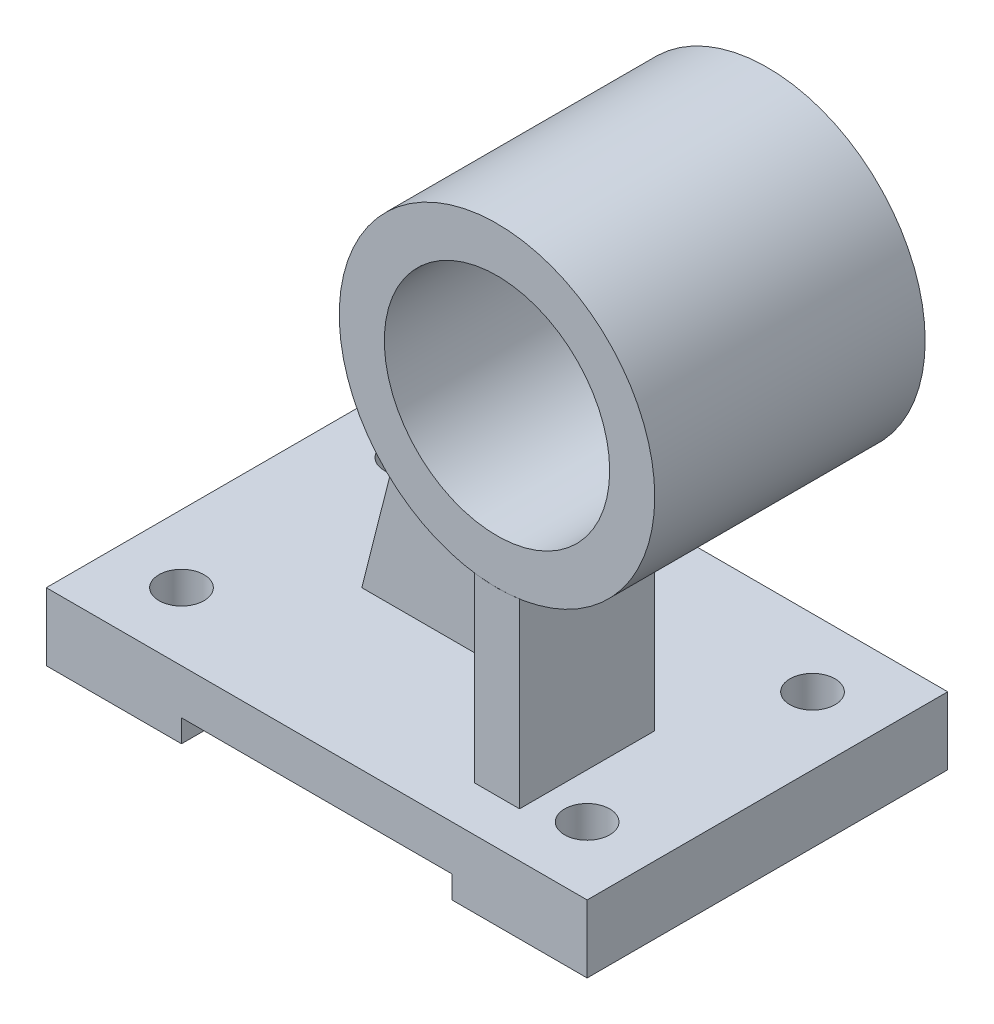
ISO-10303-21;
HEADER;
FILE_DESCRIPTION(('STEP AP214'),'2;1');
FILE_NAME('part.step','',(''),(''),'','','');
FILE_SCHEMA(('AUTOMOTIVE_DESIGN { 1 0 10303 214 1 1 1 1 }'));
ENDSEC;
DATA;
#1=APPLICATION_CONTEXT('core data for automotive mechanical design processes');
#2=APPLICATION_PROTOCOL_DEFINITION('international standard','automotive_design',2000,#1);
#3=PRODUCT_CONTEXT('',#1,'mechanical');
#4=PRODUCT('Part','Part','',(#3));
#5=PRODUCT_RELATED_PRODUCT_CATEGORY('part','',(#4));
#6=PRODUCT_DEFINITION_FORMATION('','',#4);
#7=PRODUCT_DEFINITION_CONTEXT('part definition',#1,'design');
#8=PRODUCT_DEFINITION('design','',#6,#7);
#9=PRODUCT_DEFINITION_SHAPE('','',#8);
#10=(LENGTH_UNIT() NAMED_UNIT(*) SI_UNIT(.MILLI.,.METRE.));
#11=(NAMED_UNIT(*) PLANE_ANGLE_UNIT() SI_UNIT($,.RADIAN.));
#12=(NAMED_UNIT(*) SI_UNIT($,.STERADIAN.) SOLID_ANGLE_UNIT());
#13=UNCERTAINTY_MEASURE_WITH_UNIT(LENGTH_MEASURE(1.E-05),#10,'distance_accuracy_value','');
#14=(GEOMETRIC_REPRESENTATION_CONTEXT(3) GLOBAL_UNCERTAINTY_ASSIGNED_CONTEXT((#13)) GLOBAL_UNIT_ASSIGNED_CONTEXT((#10,
#11,#12)) REPRESENTATION_CONTEXT('',''));
#15=CARTESIAN_POINT('',(0.,0.,0.));
#16=DIRECTION('',(0.,0.,1.));
#17=DIRECTION('',(1.,0.,0.));
#18=AXIS2_PLACEMENT_3D('',#15,#16,#17);
#19=CARTESIAN_POINT('',(-4.99999999999999,0.,5.));
#20=DIRECTION('',(1.,0.,0.));
#21=DIRECTION('',(0.,0.,-1.));
#22=AXIS2_PLACEMENT_3D('',#19,#20,#21);
#23=PLANE('',#22);
#24=DIRECTION('',(0.,-1.,0.));
#25=VECTOR('',#24,1.);
#26=CARTESIAN_POINT('',(-4.99999999999999,0.,-5.));
#27=LINE('',#26,#25);
#28=CARTESIAN_POINT('',(-4.99999999999999,-34.6410161513776,-5.));
#29=VERTEX_POINT('',#28);
#30=CARTESIAN_POINT('',(-4.99999999999999,-74.9643222802541,-5.));
#31=VERTEX_POINT('',#30);
#32=EDGE_CURVE('E118',#29,#31,#27,.T.);
#33=ORIENTED_EDGE('',*,*,#32,.F.);
#34=DIRECTION('',(0.,0.,-1.));
#35=VECTOR('',#34,1.);
#36=CARTESIAN_POINT('',(-4.99999999999999,-34.6410161513776,5.));
#37=LINE('',#36,#35);
#38=CARTESIAN_POINT('',(-4.99999999999999,-34.6410161513776,5.));
#39=VERTEX_POINT('',#38);
#40=EDGE_CURVE('E12',#39,#29,#37,.T.);
#41=ORIENTED_EDGE('',*,*,#40,.F.);
#42=DIRECTION('',(0.,-1.,0.));
#43=VECTOR('',#42,1.);
#44=CARTESIAN_POINT('',(-4.99999999999999,0.,5.));
#45=LINE('',#44,#43);
#46=CARTESIAN_POINT('',(-4.99999999999999,-74.9643222802541,5.));
#47=VERTEX_POINT('',#46);
#48=EDGE_CURVE('E103',#39,#47,#45,.T.);
#49=ORIENTED_EDGE('',*,*,#48,.T.);
#50=DIRECTION('',(0.,0.,-1.));
#51=VECTOR('',#50,1.);
#52=CARTESIAN_POINT('',(-4.99999999999999,-74.9643222802541,5.));
#53=LINE('',#52,#51);
#54=EDGE_CURVE('E71',#47,#31,#53,.T.);
#55=ORIENTED_EDGE('',*,*,#54,.T.);
#56=EDGE_LOOP('',(#33,#41,#49,#55));
#57=FACE_BOUND('',#56,.T.);
#58=ADVANCED_FACE('F55',(#57),#23,.T.);
#59=CARTESIAN_POINT('',(0.,0.,5.));
#60=DIRECTION('',(0.,0.,-1.));
#61=DIRECTION('',(-1.,0.,0.));
#62=AXIS2_PLACEMENT_3D('',#59,#60,#61);
#63=CYLINDRICAL_SURFACE('',#62,35.);
#64=CARTESIAN_POINT('',(0.,0.,-5.));
#65=DIRECTION('',(0.,0.,1.));
#66=DIRECTION('',(1.,0.,0.));
#67=AXIS2_PLACEMENT_3D('',#64,#65,#66);
#68=CIRCLE('',#67,35.);
#69=CARTESIAN_POINT('',(-34.4885704092509,5.96141854982036,-5.));
#70=VERTEX_POINT('',#69);
#71=EDGE_CURVE('E109',#29,#70,#68,.F.);
#72=ORIENTED_EDGE('',*,*,#71,.T.);
#73=DIRECTION('',(0.,0.,-1.));
#74=VECTOR('',#73,1.);
#75=CARTESIAN_POINT('',(-34.4885704092509,5.96141854982036,5.));
#76=LINE('',#75,#74);
#77=CARTESIAN_POINT('',(-34.4885704092509,5.96141854982036,5.));
#78=VERTEX_POINT('',#77);
#79=EDGE_CURVE('E63',#78,#70,#76,.T.);
#80=ORIENTED_EDGE('',*,*,#79,.F.);
#81=CARTESIAN_POINT('',(0.,0.,5.));
#82=DIRECTION('',(0.,0.,1.));
#83=DIRECTION('',(1.,0.,0.));
#84=AXIS2_PLACEMENT_3D('',#81,#82,#83);
#85=CIRCLE('',#84,35.);
#86=EDGE_CURVE('E97',#39,#78,#85,.F.);
#87=ORIENTED_EDGE('',*,*,#86,.F.);
#88=ORIENTED_EDGE('',*,*,#40,.T.);
#89=EDGE_LOOP('',(#72,#80,#87,#88));
#90=FACE_BOUND('',#89,.T.);
#91=ADVANCED_FACE('F107',(#90),#63,.F.);
#92=CARTESIAN_POINT('',(-33.8264734105136,8.57365432242354,5.));
#93=DIRECTION('',(-0.969348225849847,0.24569089735225,0.));
#94=DIRECTION('',(-0.24569089735225,-0.969348225849847,0.));
#95=AXIS2_PLACEMENT_3D('',#92,#93,#94);
#96=PLANE('',#95);
#97=DIRECTION('',(0.245690897352251,0.969348225849847,0.));
#98=VECTOR('',#97,1.);
#99=CARTESIAN_POINT('',(-33.8264734105136,8.57365432242354,-5.));
#100=LINE('',#99,#98);
#101=CARTESIAN_POINT('',(-55.,-74.9643222802542,-5.));
#102=VERTEX_POINT('',#101);
#103=EDGE_CURVE('E121',#102,#70,#100,.T.);
#104=ORIENTED_EDGE('',*,*,#103,.F.);
#105=DIRECTION('',(0.,0.,-1.));
#106=VECTOR('',#105,1.);
#107=CARTESIAN_POINT('',(-55.,-74.9643222802542,5.));
#108=LINE('',#107,#106);
#109=CARTESIAN_POINT('',(-55.,-74.9643222802542,5.));
#110=VERTEX_POINT('',#109);
#111=EDGE_CURVE('E84',#110,#102,#108,.T.);
#112=ORIENTED_EDGE('',*,*,#111,.F.);
#113=DIRECTION('',(0.245690897352251,0.969348225849847,0.));
#114=VECTOR('',#113,1.);
#115=CARTESIAN_POINT('',(-33.8264734105136,8.57365432242354,5.));
#116=LINE('',#115,#114);
#117=EDGE_CURVE('E102',#110,#78,#116,.T.);
#118=ORIENTED_EDGE('',*,*,#117,.T.);
#119=ORIENTED_EDGE('',*,*,#79,.T.);
#120=EDGE_LOOP('',(#104,#112,#118,#119));
#121=FACE_BOUND('',#120,.T.);
#122=ADVANCED_FACE('F112',(#121),#96,.T.);
#123=CARTESIAN_POINT('',(0.,-74.9643222802541,5.));
#124=DIRECTION('',(0.,-1.,0.));
#125=DIRECTION('',(1.,0.,0.));
#126=AXIS2_PLACEMENT_3D('',#123,#124,#125);
#127=PLANE('',#126);
#128=DIRECTION('',(-1.,0.,0.));
#129=VECTOR('',#128,1.);
#130=CARTESIAN_POINT('',(0.,-74.9643222802541,-5.));
#131=LINE('',#130,#129);
#132=EDGE_CURVE('E123',#31,#102,#131,.T.);
#133=ORIENTED_EDGE('',*,*,#132,.F.);
#134=ORIENTED_EDGE('',*,*,#54,.F.);
#135=DIRECTION('',(-1.,0.,0.));
#136=VECTOR('',#135,1.);
#137=CARTESIAN_POINT('',(0.,-74.9643222802541,5.));
#138=LINE('',#137,#136);
#139=EDGE_CURVE('E113',#47,#110,#138,.T.);
#140=ORIENTED_EDGE('',*,*,#139,.T.);
#141=ORIENTED_EDGE('',*,*,#111,.T.);
#142=EDGE_LOOP('',(#133,#134,#140,#141));
#143=FACE_BOUND('',#142,.T.);
#144=ADVANCED_FACE('F128',(#143),#127,.T.);
#145=CARTESIAN_POINT('',(0.,0.,5.));
#146=DIRECTION('',(0.,0.,1.));
#147=DIRECTION('',(1.,0.,0.));
#148=AXIS2_PLACEMENT_3D('',#145,#146,#147);
#149=PLANE('',#148);
#150=ORIENTED_EDGE('',*,*,#48,.F.);
#151=ORIENTED_EDGE('',*,*,#86,.T.);
#152=ORIENTED_EDGE('',*,*,#117,.F.);
#153=ORIENTED_EDGE('',*,*,#139,.F.);
#154=EDGE_LOOP('',(#150,#151,#152,#153));
#155=FACE_BOUND('',#154,.T.);
#156=ADVANCED_FACE('F99',(#155),#149,.T.);
#157=CARTESIAN_POINT('',(0.,0.,-5.));
#158=DIRECTION('',(0.,0.,1.));
#159=DIRECTION('',(1.,0.,0.));
#160=AXIS2_PLACEMENT_3D('',#157,#158,#159);
#161=PLANE('',#160);
#162=ORIENTED_EDGE('',*,*,#32,.T.);
#163=ORIENTED_EDGE('',*,*,#132,.T.);
#164=ORIENTED_EDGE('',*,*,#103,.T.);
#165=ORIENTED_EDGE('',*,*,#71,.F.);
#166=EDGE_LOOP('',(#162,#163,#164,#165));
#167=FACE_BOUND('',#166,.T.);
#168=ADVANCED_FACE('F135',(#167),#161,.F.);
#169=CLOSED_SHELL('',(#58,#91,#122,#144,#156,#168));
#170=MANIFOLD_SOLID_BREP('B2',#169);
#171=CARTESIAN_POINT('',(-4.99999999999999,0.,0.));
#172=DIRECTION('',(1.,0.,0.));
#173=DIRECTION('',(0.,0.,-1.));
#174=AXIS2_PLACEMENT_3D('',#171,#172,#173);
#175=PLANE('',#174);
#176=DIRECTION('',(0.,1.,0.));
#177=VECTOR('',#176,1.);
#178=CARTESIAN_POINT('',(-4.99999999999999,0.,30.));
#179=LINE('',#178,#177);
#180=CARTESIAN_POINT('',(-4.99999999999999,-74.9643222802541,30.));
#181=VERTEX_POINT('',#180);
#182=CARTESIAN_POINT('',(-4.99999999999999,-34.6410161513776,30.));
#183=VERTEX_POINT('',#182);
#184=EDGE_CURVE('E227',#181,#183,#179,.T.);
#185=ORIENTED_EDGE('',*,*,#184,.T.);
#186=DIRECTION('',(0.,0.,1.));
#187=VECTOR('',#186,1.);
#188=CARTESIAN_POINT('',(-4.99999999999999,-34.6410161513776,0.));
#189=LINE('',#188,#187);
#190=CARTESIAN_POINT('',(-4.99999999999999,-34.6410161513776,0.));
#191=VERTEX_POINT('',#190);
#192=EDGE_CURVE('E207',#191,#183,#189,.T.);
#193=ORIENTED_EDGE('',*,*,#192,.F.);
#194=DIRECTION('',(0.,1.,0.));
#195=VECTOR('',#194,1.);
#196=CARTESIAN_POINT('',(-4.99999999999999,0.,0.));
#197=LINE('',#196,#195);
#198=CARTESIAN_POINT('',(-4.99999999999999,-74.9643222802541,0.));
#199=VERTEX_POINT('',#198);
#200=EDGE_CURVE('E215',#199,#191,#197,.T.);
#201=ORIENTED_EDGE('',*,*,#200,.F.);
#202=DIRECTION('',(0.,0.,1.));
#203=VECTOR('',#202,1.);
#204=CARTESIAN_POINT('',(-4.99999999999999,-74.9643222802541,0.));
#205=LINE('',#204,#203);
#206=EDGE_CURVE('E53',#199,#181,#205,.T.);
#207=ORIENTED_EDGE('',*,*,#206,.T.);
#208=EDGE_LOOP('',(#185,#193,#201,#207));
#209=FACE_BOUND('',#208,.T.);
#210=ADVANCED_FACE('F197',(#209),#175,.F.);
#211=CARTESIAN_POINT('',(0.,0.,0.));
#212=DIRECTION('',(0.,0.,1.));
#213=DIRECTION('',(1.,0.,0.));
#214=AXIS2_PLACEMENT_3D('',#211,#212,#213);
#215=CYLINDRICAL_SURFACE('',#214,35.);
#216=CARTESIAN_POINT('',(0.,0.,30.));
#217=DIRECTION('',(0.,0.,1.));
#218=DIRECTION('',(1.,0.,0.));
#219=AXIS2_PLACEMENT_3D('',#216,#217,#218);
#220=CIRCLE('',#219,35.);
#221=CARTESIAN_POINT('',(5.00000000000001,-34.6410161513776,30.));
#222=VERTEX_POINT('',#221);
#223=EDGE_CURVE('E336',#183,#222,#220,.T.);
#224=ORIENTED_EDGE('',*,*,#223,.T.);
#225=DIRECTION('',(0.,0.,1.));
#226=VECTOR('',#225,1.);
#227=CARTESIAN_POINT('',(5.00000000000001,-34.6410161513776,0.));
#228=LINE('',#227,#226);
#229=CARTESIAN_POINT('',(5.00000000000001,-34.6410161513776,0.));
#230=VERTEX_POINT('',#229);
#231=EDGE_CURVE('E340',#230,#222,#228,.T.);
#232=ORIENTED_EDGE('',*,*,#231,.F.);
#233=CARTESIAN_POINT('',(0.,0.,0.));
#234=DIRECTION('',(0.,0.,1.));
#235=DIRECTION('',(1.,0.,0.));
#236=AXIS2_PLACEMENT_3D('',#233,#234,#235);
#237=CIRCLE('',#236,35.);
#238=EDGE_CURVE('E331',#191,#230,#237,.T.);
#239=ORIENTED_EDGE('',*,*,#238,.F.);
#240=ORIENTED_EDGE('',*,*,#192,.T.);
#241=EDGE_LOOP('',(#224,#232,#239,#240));
#242=FACE_BOUND('',#241,.T.);
#243=ADVANCED_FACE('F348',(#242),#215,.F.);
#244=CARTESIAN_POINT('',(5.00000000000001,0.,0.));
#245=DIRECTION('',(1.,0.,0.));
#246=DIRECTION('',(0.,0.,-1.));
#247=AXIS2_PLACEMENT_3D('',#244,#245,#246);
#248=PLANE('',#247);
#249=DIRECTION('',(0.,1.,0.));
#250=VECTOR('',#249,1.);
#251=CARTESIAN_POINT('',(5.00000000000001,0.,30.));
#252=LINE('',#251,#250);
#253=CARTESIAN_POINT('',(5.00000000000001,-74.9643222802541,30.));
#254=VERTEX_POINT('',#253);
#255=EDGE_CURVE('E321',#254,#222,#252,.T.);
#256=ORIENTED_EDGE('',*,*,#255,.F.);
#257=DIRECTION('',(0.,0.,1.));
#258=VECTOR('',#257,1.);
#259=CARTESIAN_POINT('',(5.00000000000001,-74.9643222802541,0.));
#260=LINE('',#259,#258);
#261=CARTESIAN_POINT('',(5.00000000000001,-74.9643222802541,0.));
#262=VERTEX_POINT('',#261);
#263=EDGE_CURVE('E201',#262,#254,#260,.T.);
#264=ORIENTED_EDGE('',*,*,#263,.F.);
#265=DIRECTION('',(0.,1.,0.));
#266=VECTOR('',#265,1.);
#267=CARTESIAN_POINT('',(5.00000000000001,0.,0.));
#268=LINE('',#267,#266);
#269=EDGE_CURVE('E329',#262,#230,#268,.T.);
#270=ORIENTED_EDGE('',*,*,#269,.T.);
#271=ORIENTED_EDGE('',*,*,#231,.T.);
#272=EDGE_LOOP('',(#256,#264,#270,#271));
#273=FACE_BOUND('',#272,.T.);
#274=ADVANCED_FACE('F199',(#273),#248,.T.);
#275=CARTESIAN_POINT('',(0.,0.,0.));
#276=DIRECTION('',(0.,0.,1.));
#277=DIRECTION('',(1.,0.,0.));
#278=AXIS2_PLACEMENT_3D('',#275,#276,#277);
#279=PLANE('',#278);
#280=DIRECTION('',(-1.,0.,0.));
#281=VECTOR('',#280,1.);
#282=CARTESIAN_POINT('',(0.,-74.9643222802541,0.));
#283=LINE('',#282,#281);
#284=EDGE_CURVE('E327',#262,#199,#283,.T.);
#285=ORIENTED_EDGE('',*,*,#284,.T.);
#286=ORIENTED_EDGE('',*,*,#200,.T.);
#287=ORIENTED_EDGE('',*,*,#238,.T.);
#288=ORIENTED_EDGE('',*,*,#269,.F.);
#289=EDGE_LOOP('',(#285,#286,#287,#288));
#290=FACE_BOUND('',#289,.T.);
#291=ADVANCED_FACE('F345',(#290),#279,.F.);
#292=CARTESIAN_POINT('',(0.,0.,30.));
#293=DIRECTION('',(0.,0.,1.));
#294=DIRECTION('',(1.,0.,0.));
#295=AXIS2_PLACEMENT_3D('',#292,#293,#294);
#296=PLANE('',#295);
#297=DIRECTION('',(-1.,0.,0.));
#298=VECTOR('',#297,1.);
#299=CARTESIAN_POINT('',(0.,-74.9643222802541,30.));
#300=LINE('',#299,#298);
#301=EDGE_CURVE('E318',#254,#181,#300,.T.);
#302=ORIENTED_EDGE('',*,*,#301,.F.);
#303=ORIENTED_EDGE('',*,*,#255,.T.);
#304=ORIENTED_EDGE('',*,*,#223,.F.);
#305=ORIENTED_EDGE('',*,*,#184,.F.);
#306=EDGE_LOOP('',(#302,#303,#304,#305));
#307=FACE_BOUND('',#306,.T.);
#308=ADVANCED_FACE('F353',(#307),#296,.T.);
#309=CARTESIAN_POINT('',(0.,-74.9643222802541,40.));
#310=DIRECTION('',(0.,-1.,0.));
#311=DIRECTION('',(0.,0.,-1.));
#312=AXIS2_PLACEMENT_3D('',#309,#310,#311);
#313=PLANE('',#312);
#314=CARTESIAN_POINT('',(15.,-74.9643222802541,-25.));
#315=DIRECTION('',(0.,1.,0.));
#316=DIRECTION('',(0.,0.,-1.));
#317=AXIS2_PLACEMENT_3D('',#314,#315,#316);
#318=CIRCLE('',#317,5.);
#319=CARTESIAN_POINT('',(15.,-74.9643222802541,-30.));
#320=VERTEX_POINT('',#319);
#321=EDGE_CURVE('E436',#320,#320,#318,.T.);
#322=ORIENTED_EDGE('',*,*,#321,.F.);
#323=EDGE_LOOP('',(#322));
#324=FACE_BOUND('',#323,.T.);
#325=CARTESIAN_POINT('',(15.,-74.9643222802541,25.));
#326=DIRECTION('',(0.,1.,0.));
#327=DIRECTION('',(0.,0.,-1.));
#328=AXIS2_PLACEMENT_3D('',#325,#326,#327);
#329=CIRCLE('',#328,5.);
#330=CARTESIAN_POINT('',(15.,-74.9643222802541,20.));
#331=VERTEX_POINT('',#330);
#332=EDGE_CURVE('E428',#331,#331,#329,.T.);
#333=ORIENTED_EDGE('',*,*,#332,.F.);
#334=EDGE_LOOP('',(#333));
#335=FACE_BOUND('',#334,.T.);
#336=CARTESIAN_POINT('',(-75.,-74.9643222802541,25.));
#337=DIRECTION('',(0.,1.,0.));
#338=DIRECTION('',(0.,0.,1.));
#339=AXIS2_PLACEMENT_3D('',#336,#337,#338);
#340=CIRCLE('',#339,5.);
#341=CARTESIAN_POINT('',(-75.,-74.9643222802541,30.));
#342=VERTEX_POINT('',#341);
#343=EDGE_CURVE('E421',#342,#342,#340,.T.);
#344=ORIENTED_EDGE('',*,*,#343,.F.);
#345=EDGE_LOOP('',(#344));
#346=FACE_BOUND('',#345,.T.);
#347=CARTESIAN_POINT('',(-75.,-74.9643222802541,-25.));
#348=DIRECTION('',(0.,1.,0.));
#349=DIRECTION('',(0.,0.,1.));
#350=AXIS2_PLACEMENT_3D('',#347,#348,#349);
#351=CIRCLE('',#350,5.);
#352=CARTESIAN_POINT('',(-75.,-74.9643222802541,-20.));
#353=VERTEX_POINT('',#352);
#354=EDGE_CURVE('E423',#353,#353,#351,.T.);
#355=ORIENTED_EDGE('',*,*,#354,.F.);
#356=EDGE_LOOP('',(#355));
#357=FACE_BOUND('',#356,.T.);
#358=DIRECTION('',(-1.,0.,0.));
#359=VECTOR('',#358,1.);
#360=CARTESIAN_POINT('',(0.,-74.9643222802541,-40.));
#361=LINE('',#360,#359);
#362=CARTESIAN_POINT('',(30.,-74.9643222802541,-40.));
#363=VERTEX_POINT('',#362);
#364=CARTESIAN_POINT('',(-90.,-74.9643222802542,-40.));
#365=VERTEX_POINT('',#364);
#366=EDGE_CURVE('E312',#363,#365,#361,.T.);
#367=ORIENTED_EDGE('',*,*,#366,.T.);
#368=DIRECTION('',(0.,0.,-1.));
#369=VECTOR('',#368,1.);
#370=CARTESIAN_POINT('',(-90.,-74.9643222802542,40.));
#371=LINE('',#370,#369);
#372=CARTESIAN_POINT('',(-90.,-74.9643222802542,40.));
#373=VERTEX_POINT('',#372);
#374=EDGE_CURVE('E297',#373,#365,#371,.T.);
#375=ORIENTED_EDGE('',*,*,#374,.F.);
#376=DIRECTION('',(-1.,0.,0.));
#377=VECTOR('',#376,1.);
#378=CARTESIAN_POINT('',(-90.,-74.9643222802542,40.));
#379=LINE('',#378,#377);
#380=CARTESIAN_POINT('',(30.,-74.9643222802541,40.));
#381=VERTEX_POINT('',#380);
#382=EDGE_CURVE('E303',#381,#373,#379,.T.);
#383=ORIENTED_EDGE('',*,*,#382,.F.);
#384=DIRECTION('',(0.,0.,-1.));
#385=VECTOR('',#384,1.);
#386=CARTESIAN_POINT('',(30.,-74.9643222802541,40.));
#387=LINE('',#386,#385);
#388=EDGE_CURVE('E455',#381,#363,#387,.T.);
#389=ORIENTED_EDGE('',*,*,#388,.T.);
#390=EDGE_LOOP('',(#367,#375,#383,#389));
#391=FACE_BOUND('',#390,.T.);
#392=ORIENTED_EDGE('',*,*,#263,.T.);
#393=ORIENTED_EDGE('',*,*,#301,.T.);
#394=ORIENTED_EDGE('',*,*,#206,.F.);
#395=ORIENTED_EDGE('',*,*,#284,.F.);
#396=EDGE_LOOP('',(#392,#393,#394,#395));
#397=FACE_BOUND('',#396,.T.);
#398=ADVANCED_FACE('F314',(#324,#335,#346,#357,#391,#397),#313,.F.);
#399=CARTESIAN_POINT('',(-90.,-89.9643222802542,40.));
#400=DIRECTION('',(1.,0.,0.));
#401=DIRECTION('',(0.,0.,-1.));
#402=AXIS2_PLACEMENT_3D('',#399,#400,#401);
#403=PLANE('',#402);
#404=DIRECTION('',(0.,-1.,0.));
#405=VECTOR('',#404,1.);
#406=CARTESIAN_POINT('',(-90.,-89.9643222802542,-40.));
#407=LINE('',#406,#405);
#408=CARTESIAN_POINT('',(-90.,-89.9643222802542,-40.));
#409=VERTEX_POINT('',#408);
#410=EDGE_CURVE('E443',#365,#409,#407,.T.);
#411=ORIENTED_EDGE('',*,*,#410,.T.);
#412=DIRECTION('',(0.,0.,-1.));
#413=VECTOR('',#412,1.);
#414=CARTESIAN_POINT('',(-90.,-89.9643222802542,40.));
#415=LINE('',#414,#413);
#416=CARTESIAN_POINT('',(-90.,-89.9643222802542,40.));
#417=VERTEX_POINT('',#416);
#418=EDGE_CURVE('E299',#417,#409,#415,.T.);
#419=ORIENTED_EDGE('',*,*,#418,.F.);
#420=DIRECTION('',(0.,-1.,0.));
#421=VECTOR('',#420,1.);
#422=CARTESIAN_POINT('',(-90.,-89.9643222802542,40.));
#423=LINE('',#422,#421);
#424=EDGE_CURVE('E293',#373,#417,#423,.T.);
#425=ORIENTED_EDGE('',*,*,#424,.F.);
#426=ORIENTED_EDGE('',*,*,#374,.T.);
#427=EDGE_LOOP('',(#411,#419,#425,#426));
#428=FACE_BOUND('',#427,.T.);
#429=ADVANCED_FACE('F295',(#428),#403,.F.);
#430=CARTESIAN_POINT('',(-60.,-89.9643222802542,40.));
#431=DIRECTION('',(0.,1.,0.));
#432=DIRECTION('',(0.,0.,1.));
#433=AXIS2_PLACEMENT_3D('',#430,#431,#432);
#434=PLANE('',#433);
#435=CARTESIAN_POINT('',(-75.,-89.9643222802542,25.));
#436=DIRECTION('',(0.,1.,0.));
#437=DIRECTION('',(0.,0.,1.));
#438=AXIS2_PLACEMENT_3D('',#435,#436,#437);
#439=CIRCLE('',#438,5.);
#440=CARTESIAN_POINT('',(-75.,-89.9643222802542,30.));
#441=VERTEX_POINT('',#440);
#442=EDGE_CURVE('E418',#441,#441,#439,.T.);
#443=ORIENTED_EDGE('',*,*,#442,.T.);
#444=EDGE_LOOP('',(#443));
#445=FACE_BOUND('',#444,.T.);
#446=CARTESIAN_POINT('',(-75.,-89.9643222802542,-25.));
#447=DIRECTION('',(0.,1.,0.));
#448=DIRECTION('',(0.,0.,1.));
#449=AXIS2_PLACEMENT_3D('',#446,#447,#448);
#450=CIRCLE('',#449,5.);
#451=CARTESIAN_POINT('',(-75.,-89.9643222802542,-20.));
#452=VERTEX_POINT('',#451);
#453=EDGE_CURVE('E426',#452,#452,#450,.T.);
#454=ORIENTED_EDGE('',*,*,#453,.T.);
#455=EDGE_LOOP('',(#454));
#456=FACE_BOUND('',#455,.T.);
#457=DIRECTION('',(1.,0.,0.));
#458=VECTOR('',#457,1.);
#459=CARTESIAN_POINT('',(-60.,-89.9643222802542,-40.));
#460=LINE('',#459,#458);
#461=CARTESIAN_POINT('',(-60.,-89.9643222802542,-40.));
#462=VERTEX_POINT('',#461);
#463=EDGE_CURVE('E457',#409,#462,#460,.T.);
#464=ORIENTED_EDGE('',*,*,#463,.T.);
#465=DIRECTION('',(0.,0.,-1.));
#466=VECTOR('',#465,1.);
#467=CARTESIAN_POINT('',(-60.,-89.9643222802542,40.));
#468=LINE('',#467,#466);
#469=CARTESIAN_POINT('',(-60.,-89.9643222802542,40.));
#470=VERTEX_POINT('',#469);
#471=EDGE_CURVE('E323',#470,#462,#468,.T.);
#472=ORIENTED_EDGE('',*,*,#471,.F.);
#473=DIRECTION('',(1.,0.,0.));
#474=VECTOR('',#473,1.);
#475=CARTESIAN_POINT('',(-60.,-89.9643222802542,40.));
#476=LINE('',#475,#474);
#477=EDGE_CURVE('E302',#417,#470,#476,.T.);
#478=ORIENTED_EDGE('',*,*,#477,.F.);
#479=ORIENTED_EDGE('',*,*,#418,.T.);
#480=EDGE_LOOP('',(#464,#472,#478,#479));
#481=FACE_BOUND('',#480,.T.);
#482=ADVANCED_FACE('F365',(#445,#456,#481),#434,.F.);
#483=CARTESIAN_POINT('',(-60.,-84.9643222802542,40.));
#484=DIRECTION('',(-1.,0.,0.));
#485=DIRECTION('',(0.,0.,1.));
#486=AXIS2_PLACEMENT_3D('',#483,#484,#485);
#487=PLANE('',#486);
#488=DIRECTION('',(0.,1.,0.));
#489=VECTOR('',#488,1.);
#490=CARTESIAN_POINT('',(-60.,-84.9643222802542,-40.));
#491=LINE('',#490,#489);
#492=CARTESIAN_POINT('',(-60.,-84.9643222802542,-40.));
#493=VERTEX_POINT('',#492);
#494=EDGE_CURVE('E459',#462,#493,#491,.T.);
#495=ORIENTED_EDGE('',*,*,#494,.T.);
#496=DIRECTION('',(0.,0.,-1.));
#497=VECTOR('',#496,1.);
#498=CARTESIAN_POINT('',(-60.,-84.9643222802542,40.));
#499=LINE('',#498,#497);
#500=CARTESIAN_POINT('',(-60.,-84.9643222802542,40.));
#501=VERTEX_POINT('',#500);
#502=EDGE_CURVE('E480',#501,#493,#499,.T.);
#503=ORIENTED_EDGE('',*,*,#502,.F.);
#504=DIRECTION('',(0.,1.,0.));
#505=VECTOR('',#504,1.);
#506=CARTESIAN_POINT('',(-60.,-84.9643222802542,40.));
#507=LINE('',#506,#505);
#508=EDGE_CURVE('E446',#470,#501,#507,.T.);
#509=ORIENTED_EDGE('',*,*,#508,.F.);
#510=ORIENTED_EDGE('',*,*,#471,.T.);
#511=EDGE_LOOP('',(#495,#503,#509,#510));
#512=FACE_BOUND('',#511,.T.);
#513=ADVANCED_FACE('F368',(#512),#487,.F.);
#514=CARTESIAN_POINT('',(0.,-84.9643222802541,40.));
#515=DIRECTION('',(0.,1.,0.));
#516=DIRECTION('',(-1.,0.,0.));
#517=AXIS2_PLACEMENT_3D('',#514,#515,#516);
#518=PLANE('',#517);
#519=DIRECTION('',(1.,0.,0.));
#520=VECTOR('',#519,1.);
#521=CARTESIAN_POINT('',(0.,-84.9643222802541,-40.));
#522=LINE('',#521,#520);
#523=CARTESIAN_POINT('',(0.,-84.9643222802541,-40.));
#524=VERTEX_POINT('',#523);
#525=EDGE_CURVE('E461',#493,#524,#522,.T.);
#526=ORIENTED_EDGE('',*,*,#525,.T.);
#527=DIRECTION('',(0.,0.,-1.));
#528=VECTOR('',#527,1.);
#529=CARTESIAN_POINT('',(0.,-84.9643222802541,40.));
#530=LINE('',#529,#528);
#531=CARTESIAN_POINT('',(0.,-84.9643222802541,40.));
#532=VERTEX_POINT('',#531);
#533=EDGE_CURVE('E477',#532,#524,#530,.T.);
#534=ORIENTED_EDGE('',*,*,#533,.F.);
#535=DIRECTION('',(1.,0.,0.));
#536=VECTOR('',#535,1.);
#537=CARTESIAN_POINT('',(0.,-84.9643222802541,40.));
#538=LINE('',#537,#536);
#539=EDGE_CURVE('E448',#501,#532,#538,.T.);
#540=ORIENTED_EDGE('',*,*,#539,.F.);
#541=ORIENTED_EDGE('',*,*,#502,.T.);
#542=EDGE_LOOP('',(#526,#534,#540,#541));
#543=FACE_BOUND('',#542,.T.);
#544=ADVANCED_FACE('F372',(#543),#518,.F.);
#545=CARTESIAN_POINT('',(0.,-89.9643222802541,40.));
#546=DIRECTION('',(1.,0.,0.));
#547=DIRECTION('',(0.,0.,-1.));
#548=AXIS2_PLACEMENT_3D('',#545,#546,#547);
#549=PLANE('',#548);
#550=DIRECTION('',(0.,-1.,0.));
#551=VECTOR('',#550,1.);
#552=CARTESIAN_POINT('',(0.,-89.9643222802541,-40.));
#553=LINE('',#552,#551);
#554=CARTESIAN_POINT('',(0.,-89.9643222802541,-40.));
#555=VERTEX_POINT('',#554);
#556=EDGE_CURVE('E463',#524,#555,#553,.T.);
#557=ORIENTED_EDGE('',*,*,#556,.T.);
#558=DIRECTION('',(0.,0.,-1.));
#559=VECTOR('',#558,1.);
#560=CARTESIAN_POINT('',(0.,-89.9643222802541,40.));
#561=LINE('',#560,#559);
#562=CARTESIAN_POINT('',(0.,-89.9643222802541,40.));
#563=VERTEX_POINT('',#562);
#564=EDGE_CURVE('E474',#563,#555,#561,.T.);
#565=ORIENTED_EDGE('',*,*,#564,.F.);
#566=DIRECTION('',(0.,-1.,0.));
#567=VECTOR('',#566,1.);
#568=CARTESIAN_POINT('',(0.,-89.9643222802541,40.));
#569=LINE('',#568,#567);
#570=EDGE_CURVE('E450',#532,#563,#569,.T.);
#571=ORIENTED_EDGE('',*,*,#570,.F.);
#572=ORIENTED_EDGE('',*,*,#533,.T.);
#573=EDGE_LOOP('',(#557,#565,#571,#572));
#574=FACE_BOUND('',#573,.T.);
#575=ADVANCED_FACE('F376',(#574),#549,.F.);
#576=CARTESIAN_POINT('',(30.,-89.9643222802541,40.));
#577=DIRECTION('',(0.,1.,0.));
#578=DIRECTION('',(0.,0.,1.));
#579=AXIS2_PLACEMENT_3D('',#576,#577,#578);
#580=PLANE('',#579);
#581=CARTESIAN_POINT('',(15.,-89.9643222802542,-25.));
#582=DIRECTION('',(0.,1.,0.));
#583=DIRECTION('',(0.,0.,-1.));
#584=AXIS2_PLACEMENT_3D('',#581,#582,#583);
#585=CIRCLE('',#584,5.);
#586=CARTESIAN_POINT('',(15.,-89.9643222802542,-30.));
#587=VERTEX_POINT('',#586);
#588=EDGE_CURVE('E439',#587,#587,#585,.T.);
#589=ORIENTED_EDGE('',*,*,#588,.T.);
#590=EDGE_LOOP('',(#589));
#591=FACE_BOUND('',#590,.T.);
#592=CARTESIAN_POINT('',(15.,-89.9643222802542,25.));
#593=DIRECTION('',(0.,1.,0.));
#594=DIRECTION('',(0.,0.,-1.));
#595=AXIS2_PLACEMENT_3D('',#592,#593,#594);
#596=CIRCLE('',#595,5.);
#597=CARTESIAN_POINT('',(15.,-89.9643222802542,20.));
#598=VERTEX_POINT('',#597);
#599=EDGE_CURVE('E433',#598,#598,#596,.T.);
#600=ORIENTED_EDGE('',*,*,#599,.T.);
#601=EDGE_LOOP('',(#600));
#602=FACE_BOUND('',#601,.T.);
#603=DIRECTION('',(1.,0.,0.));
#604=VECTOR('',#603,1.);
#605=CARTESIAN_POINT('',(30.,-89.9643222802541,-40.));
#606=LINE('',#605,#604);
#607=CARTESIAN_POINT('',(30.,-89.9643222802541,-40.));
#608=VERTEX_POINT('',#607);
#609=EDGE_CURVE('E465',#555,#608,#606,.T.);
#610=ORIENTED_EDGE('',*,*,#609,.T.);
#611=DIRECTION('',(0.,0.,-1.));
#612=VECTOR('',#611,1.);
#613=CARTESIAN_POINT('',(30.,-89.9643222802541,40.));
#614=LINE('',#613,#612);
#615=CARTESIAN_POINT('',(30.,-89.9643222802541,40.));
#616=VERTEX_POINT('',#615);
#617=EDGE_CURVE('E471',#616,#608,#614,.T.);
#618=ORIENTED_EDGE('',*,*,#617,.F.);
#619=DIRECTION('',(1.,0.,0.));
#620=VECTOR('',#619,1.);
#621=CARTESIAN_POINT('',(30.,-89.9643222802541,40.));
#622=LINE('',#621,#620);
#623=EDGE_CURVE('E452',#563,#616,#622,.T.);
#624=ORIENTED_EDGE('',*,*,#623,.F.);
#625=ORIENTED_EDGE('',*,*,#564,.T.);
#626=EDGE_LOOP('',(#610,#618,#624,#625));
#627=FACE_BOUND('',#626,.T.);
#628=ADVANCED_FACE('F380',(#591,#602,#627),#580,.F.);
#629=CARTESIAN_POINT('',(30.,-74.9643222802541,40.));
#630=DIRECTION('',(-1.,0.,0.));
#631=DIRECTION('',(0.,-1.,0.));
#632=AXIS2_PLACEMENT_3D('',#629,#630,#631);
#633=PLANE('',#632);
#634=DIRECTION('',(0.,1.,0.));
#635=VECTOR('',#634,1.);
#636=CARTESIAN_POINT('',(30.,-74.9643222802541,-40.));
#637=LINE('',#636,#635);
#638=EDGE_CURVE('E467',#608,#363,#637,.T.);
#639=ORIENTED_EDGE('',*,*,#638,.T.);
#640=ORIENTED_EDGE('',*,*,#388,.F.);
#641=DIRECTION('',(0.,1.,0.));
#642=VECTOR('',#641,1.);
#643=CARTESIAN_POINT('',(30.,-74.9643222802541,40.));
#644=LINE('',#643,#642);
#645=EDGE_CURVE('E308',#616,#381,#644,.T.);
#646=ORIENTED_EDGE('',*,*,#645,.F.);
#647=ORIENTED_EDGE('',*,*,#617,.T.);
#648=EDGE_LOOP('',(#639,#640,#646,#647));
#649=FACE_BOUND('',#648,.T.);
#650=ADVANCED_FACE('F384',(#649),#633,.F.);
#651=CARTESIAN_POINT('',(0.,0.,40.));
#652=DIRECTION('',(0.,0.,-1.));
#653=DIRECTION('',(-1.,0.,0.));
#654=AXIS2_PLACEMENT_3D('',#651,#652,#653);
#655=PLANE('',#654);
#656=ORIENTED_EDGE('',*,*,#382,.T.);
#657=ORIENTED_EDGE('',*,*,#424,.T.);
#658=ORIENTED_EDGE('',*,*,#477,.T.);
#659=ORIENTED_EDGE('',*,*,#508,.T.);
#660=ORIENTED_EDGE('',*,*,#539,.T.);
#661=ORIENTED_EDGE('',*,*,#570,.T.);
#662=ORIENTED_EDGE('',*,*,#623,.T.);
#663=ORIENTED_EDGE('',*,*,#645,.T.);
#664=EDGE_LOOP('',(#656,#657,#658,#659,#660,#661,#662,#663));
#665=FACE_BOUND('',#664,.T.);
#666=ADVANCED_FACE('F306',(#665),#655,.F.);
#667=CARTESIAN_POINT('',(0.,0.,-40.));
#668=DIRECTION('',(0.,0.,-1.));
#669=DIRECTION('',(-1.,0.,0.));
#670=AXIS2_PLACEMENT_3D('',#667,#668,#669);
#671=PLANE('',#670);
#672=ORIENTED_EDGE('',*,*,#410,.F.);
#673=ORIENTED_EDGE('',*,*,#366,.F.);
#674=ORIENTED_EDGE('',*,*,#638,.F.);
#675=ORIENTED_EDGE('',*,*,#609,.F.);
#676=ORIENTED_EDGE('',*,*,#556,.F.);
#677=ORIENTED_EDGE('',*,*,#525,.F.);
#678=ORIENTED_EDGE('',*,*,#494,.F.);
#679=ORIENTED_EDGE('',*,*,#463,.F.);
#680=EDGE_LOOP('',(#672,#673,#674,#675,#676,#677,#678,#679));
#681=FACE_BOUND('',#680,.T.);
#682=ADVANCED_FACE('F392',(#681),#671,.T.);
#683=CARTESIAN_POINT('',(15.,-89.9643222802542,25.));
#684=DIRECTION('',(0.,1.,0.));
#685=DIRECTION('',(0.,0.,1.));
#686=AXIS2_PLACEMENT_3D('',#683,#684,#685);
#687=CYLINDRICAL_SURFACE('',#686,5.);
#688=ORIENTED_EDGE('',*,*,#599,.F.);
#689=EDGE_LOOP('',(#688));
#690=FACE_BOUND('',#689,.T.);
#691=ORIENTED_EDGE('',*,*,#332,.T.);
#692=EDGE_LOOP('',(#691));
#693=FACE_BOUND('',#692,.T.);
#694=ADVANCED_FACE('F395',(#690,#693),#687,.F.);
#695=CARTESIAN_POINT('',(15.,-89.9643222802542,-25.));
#696=DIRECTION('',(0.,1.,0.));
#697=DIRECTION('',(0.,0.,1.));
#698=AXIS2_PLACEMENT_3D('',#695,#696,#697);
#699=CYLINDRICAL_SURFACE('',#698,5.);
#700=ORIENTED_EDGE('',*,*,#588,.F.);
#701=EDGE_LOOP('',(#700));
#702=FACE_BOUND('',#701,.T.);
#703=ORIENTED_EDGE('',*,*,#321,.T.);
#704=EDGE_LOOP('',(#703));
#705=FACE_BOUND('',#704,.T.);
#706=ADVANCED_FACE('F403',(#702,#705),#699,.F.);
#707=CARTESIAN_POINT('',(-75.,-89.9643222802542,-25.));
#708=DIRECTION('',(0.,1.,0.));
#709=DIRECTION('',(0.,0.,1.));
#710=AXIS2_PLACEMENT_3D('',#707,#708,#709);
#711=CYLINDRICAL_SURFACE('',#710,5.);
#712=ORIENTED_EDGE('',*,*,#453,.F.);
#713=EDGE_LOOP('',(#712));
#714=FACE_BOUND('',#713,.T.);
#715=ORIENTED_EDGE('',*,*,#354,.T.);
#716=EDGE_LOOP('',(#715));
#717=FACE_BOUND('',#716,.T.);
#718=ADVANCED_FACE('F399',(#714,#717),#711,.F.);
#719=CARTESIAN_POINT('',(-75.,-89.9643222802542,25.));
#720=DIRECTION('',(0.,1.,0.));
#721=DIRECTION('',(0.,0.,1.));
#722=AXIS2_PLACEMENT_3D('',#719,#720,#721);
#723=CYLINDRICAL_SURFACE('',#722,5.);
#724=ORIENTED_EDGE('',*,*,#442,.F.);
#725=EDGE_LOOP('',(#724));
#726=FACE_BOUND('',#725,.T.);
#727=ORIENTED_EDGE('',*,*,#343,.T.);
#728=EDGE_LOOP('',(#727));
#729=FACE_BOUND('',#728,.T.);
#730=ADVANCED_FACE('F402',(#726,#729),#723,.F.);
#731=CLOSED_SHELL('',(#210,#243,#274,#291,#308,#398,#429,#482,#513,#544,#575,#628,#650,#666,
#682,#694,#706,#718,#730));
#732=MANIFOLD_SOLID_BREP('B6',#731);
#733=CARTESIAN_POINT('',(0.,0.,-30.));
#734=DIRECTION('',(0.,0.,1.));
#735=DIRECTION('',(1.,0.,0.));
#736=AXIS2_PLACEMENT_3D('',#733,#734,#735);
#737=CYLINDRICAL_SURFACE('',#736,35.);
#738=CARTESIAN_POINT('',(0.,0.,-30.));
#739=DIRECTION('',(0.,0.,1.));
#740=DIRECTION('',(1.,0.,0.));
#741=AXIS2_PLACEMENT_3D('',#738,#739,#740);
#742=CIRCLE('',#741,35.);
#743=CARTESIAN_POINT('',(35.,0.,-30.));
#744=VERTEX_POINT('',#743);
#745=EDGE_CURVE('E196',#744,#744,#742,.T.);
#746=ORIENTED_EDGE('',*,*,#745,.T.);
#747=EDGE_LOOP('',(#746));
#748=FACE_BOUND('',#747,.T.);
#749=CARTESIAN_POINT('',(0.,0.,30.));
#750=DIRECTION('',(0.,0.,1.));
#751=DIRECTION('',(1.,0.,0.));
#752=AXIS2_PLACEMENT_3D('',#749,#750,#751);
#753=CIRCLE('',#752,35.);
#754=CARTESIAN_POINT('',(35.,0.,30.));
#755=VERTEX_POINT('',#754);
#756=EDGE_CURVE('E676',#755,#755,#753,.T.);
#757=ORIENTED_EDGE('',*,*,#756,.F.);
#758=EDGE_LOOP('',(#757));
#759=FACE_BOUND('',#758,.T.);
#760=ADVANCED_FACE('F673',(#748,#759),#737,.T.);
#761=CARTESIAN_POINT('',(0.,0.,-30.));
#762=DIRECTION('',(0.,0.,1.));
#763=DIRECTION('',(1.,0.,0.));
#764=AXIS2_PLACEMENT_3D('',#761,#762,#763);
#765=PLANE('',#764);
#766=CARTESIAN_POINT('',(0.,0.,-30.));
#767=DIRECTION('',(0.,0.,1.));
#768=DIRECTION('',(1.,0.,0.));
#769=AXIS2_PLACEMENT_3D('',#766,#767,#768);
#770=CIRCLE('',#769,25.);
#771=CARTESIAN_POINT('',(25.,0.,-30.));
#772=VERTEX_POINT('',#771);
#773=EDGE_CURVE('E683',#772,#772,#770,.T.);
#774=ORIENTED_EDGE('',*,*,#773,.T.);
#775=EDGE_LOOP('',(#774));
#776=FACE_BOUND('',#775,.T.);
#777=ORIENTED_EDGE('',*,*,#745,.F.);
#778=EDGE_LOOP('',(#777));
#779=FACE_BOUND('',#778,.T.);
#780=ADVANCED_FACE('F691',(#776,#779),#765,.F.);
#781=CARTESIAN_POINT('',(0.,0.,30.));
#782=DIRECTION('',(0.,0.,1.));
#783=DIRECTION('',(1.,0.,0.));
#784=AXIS2_PLACEMENT_3D('',#781,#782,#783);
#785=PLANE('',#784);
#786=CARTESIAN_POINT('',(0.,0.,30.));
#787=DIRECTION('',(0.,0.,1.));
#788=DIRECTION('',(1.,0.,0.));
#789=AXIS2_PLACEMENT_3D('',#786,#787,#788);
#790=CIRCLE('',#789,25.);
#791=CARTESIAN_POINT('',(25.,0.,30.));
#792=VERTEX_POINT('',#791);
#793=EDGE_CURVE('E685',#792,#792,#790,.T.);
#794=ORIENTED_EDGE('',*,*,#793,.F.);
#795=EDGE_LOOP('',(#794));
#796=FACE_BOUND('',#795,.T.);
#797=ORIENTED_EDGE('',*,*,#756,.T.);
#798=EDGE_LOOP('',(#797));
#799=FACE_BOUND('',#798,.T.);
#800=ADVANCED_FACE('F697',(#796,#799),#785,.T.);
#801=CARTESIAN_POINT('',(0.,0.,-30.));
#802=DIRECTION('',(0.,0.,1.));
#803=DIRECTION('',(1.,0.,0.));
#804=AXIS2_PLACEMENT_3D('',#801,#802,#803);
#805=CYLINDRICAL_SURFACE('',#804,25.);
#806=ORIENTED_EDGE('',*,*,#773,.F.);
#807=EDGE_LOOP('',(#806));
#808=FACE_BOUND('',#807,.T.);
#809=ORIENTED_EDGE('',*,*,#793,.T.);
#810=EDGE_LOOP('',(#809));
#811=FACE_BOUND('',#810,.T.);
#812=ADVANCED_FACE('F694',(#808,#811),#805,.F.);
#813=CLOSED_SHELL('',(#760,#780,#800,#812));
#814=MANIFOLD_SOLID_BREP('B47',#813);
#815=ADVANCED_BREP_SHAPE_REPRESENTATION('',(#18,#170,#732,#814),#14);
#816=SHAPE_DEFINITION_REPRESENTATION(#9,#815);
ENDSEC;
END-ISO-10303-21;
